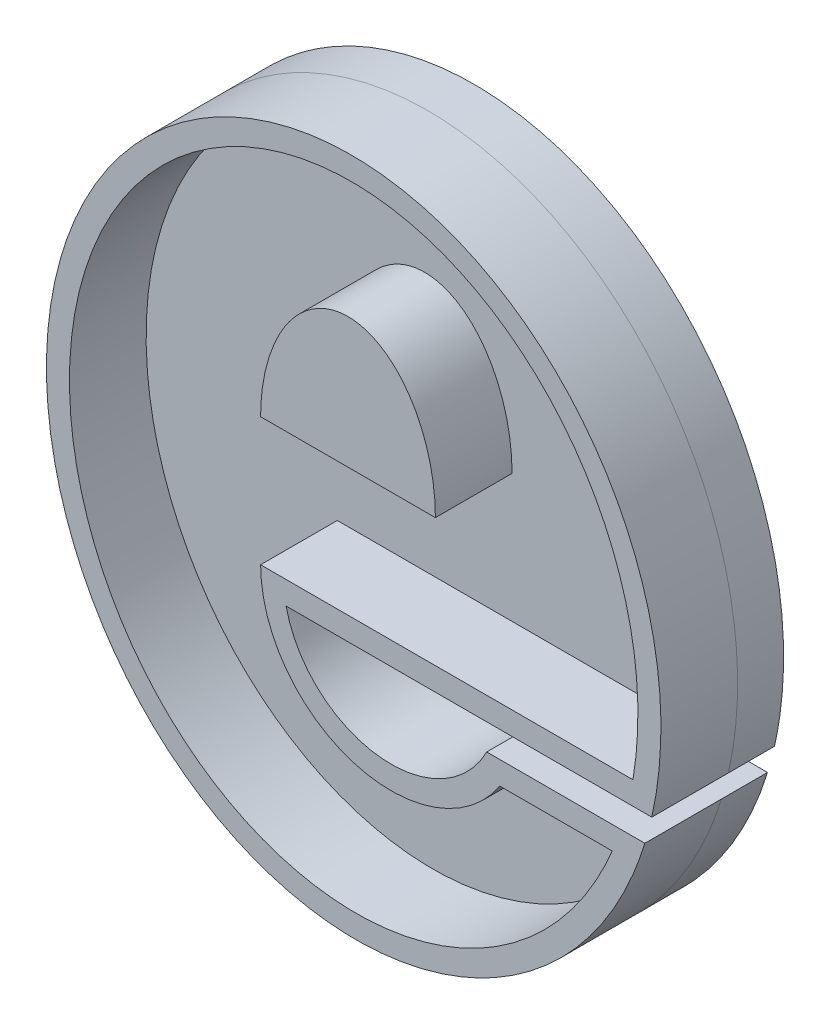
ISO-10303-21;
HEADER;
FILE_DESCRIPTION(('STEP AP214'),'2;1');
FILE_NAME('part.step','',(''),(''),'','','');
FILE_SCHEMA(('AUTOMOTIVE_DESIGN { 1 0 10303 214 1 1 1 1 }'));
ENDSEC;
DATA;
#1=APPLICATION_CONTEXT('core data for automotive mechanical design processes');
#2=APPLICATION_PROTOCOL_DEFINITION('international standard','automotive_design',2000,#1);
#3=PRODUCT_CONTEXT('',#1,'mechanical');
#4=PRODUCT('Part','Part','',(#3));
#5=PRODUCT_RELATED_PRODUCT_CATEGORY('part','',(#4));
#6=PRODUCT_DEFINITION_FORMATION('','',#4);
#7=PRODUCT_DEFINITION_CONTEXT('part definition',#1,'design');
#8=PRODUCT_DEFINITION('design','',#6,#7);
#9=PRODUCT_DEFINITION_SHAPE('','',#8);
#10=(LENGTH_UNIT() NAMED_UNIT(*) SI_UNIT(.MILLI.,.METRE.));
#11=(NAMED_UNIT(*) PLANE_ANGLE_UNIT() SI_UNIT($,.RADIAN.));
#12=(NAMED_UNIT(*) SI_UNIT($,.STERADIAN.) SOLID_ANGLE_UNIT());
#13=UNCERTAINTY_MEASURE_WITH_UNIT(LENGTH_MEASURE(1.E-05),#10,'distance_accuracy_value','');
#14=(GEOMETRIC_REPRESENTATION_CONTEXT(3) GLOBAL_UNCERTAINTY_ASSIGNED_CONTEXT((#13)) GLOBAL_UNIT_ASSIGNED_CONTEXT((#10,
#11,#12)) REPRESENTATION_CONTEXT('',''));
#15=CARTESIAN_POINT('',(0.,0.,0.));
#16=DIRECTION('',(0.,0.,1.));
#17=DIRECTION('',(1.,0.,0.));
#18=AXIS2_PLACEMENT_3D('',#15,#16,#17);
#19=CARTESIAN_POINT('',(2.43894998010459,-4.01549663287577,5.));
#20=DIRECTION('',(0.,0.,1.));
#21=DIRECTION('',(1.,0.,0.));
#22=AXIS2_PLACEMENT_3D('',#19,#20,#21);
#23=PLANE('',#22);
#24=CARTESIAN_POINT('',(2.43894998010459,-4.01549663287577,5.));
#25=DIRECTION('',(0.,0.,-1.));
#26=DIRECTION('',(1.,0.,0.));
#27=AXIS2_PLACEMENT_3D('',#24,#25,#26);
#28=CIRCLE('',#27,7.01);
#29=CARTESIAN_POINT('',(8.67594444859663,-7.21549663287573,5.));
#30=VERTEX_POINT('',#29);
#31=CARTESIAN_POINT('',(-4.40868464799875,-5.51549663287577,5.));
#32=VERTEX_POINT('',#31);
#33=EDGE_CURVE('E206',#30,#32,#28,.T.);
#34=ORIENTED_EDGE('',*,*,#33,.T.);
#35=DIRECTION('',(1.,7.4469390179085E-12,0.));
#36=VECTOR('',#35,1.);
#37=CARTESIAN_POINT('',(-4.40868464799875,-5.51549663287577,5.));
#38=LINE('',#37,#36);
#39=CARTESIAN_POINT('',(19.4413378459101,-5.51549663269816,5.));
#40=VERTEX_POINT('',#39);
#41=EDGE_CURVE('E209',#32,#40,#38,.T.);
#42=ORIENTED_EDGE('',*,*,#41,.T.);
#43=CARTESIAN_POINT('',(19.4413378459101,-5.51549663269816,5.));
#44=CARTESIAN_POINT('',(20.0644750808031,-2.76938934887526,5.));
#45=CARTESIAN_POINT('',(20.3371728987295,2.99499397625619,5.));
#46=CARTESIAN_POINT('',(17.7717027992243,11.2083095359968,5.));
#47=CARTESIAN_POINT('',(12.5782163197493,17.8056525984116,5.));
#48=CARTESIAN_POINT('',(5.47426072221383,21.7911037813687,5.));
#49=CARTESIAN_POINT('',(-2.49105719793422,22.5104083720527,5.));
#50=CARTESIAN_POINT('',(-10.0690867920155,19.832544712174,5.));
#51=CARTESIAN_POINT('',(-16.0955657956478,14.2105751261257,5.));
#52=CARTESIAN_POINT('',(-19.7130802001289,6.52607468019531,5.));
#53=CARTESIAN_POINT('',(-20.43576809698,-2.09172730620284,5.));
#54=CARTESIAN_POINT('',(-18.1711388458301,-10.4079610275275,5.));
#55=CARTESIAN_POINT('',(-13.2243374242688,-17.2246063489635,5.));
#56=CARTESIAN_POINT('',(-6.27583011584605,-21.5204603011031,5.));
#57=CARTESIAN_POINT('',(1.65648015779686,-22.5965329394962,5.));
#58=CARTESIAN_POINT('',(9.33334089175882,-20.2623857931394,5.));
#59=CARTESIAN_POINT('',(14.5283907911395,-15.7997054667533,5.));
#60=CARTESIAN_POINT('',(17.5172304412448,-11.156612751525,5.));
#61=CARTESIAN_POINT('',(18.5805261899058,-8.54737142086325,5.));
#62=CARTESIAN_POINT('',(18.9887513803492,-7.21549663287369,5.));
#63=B_SPLINE_CURVE_WITH_KNOTS('',3,(#43,#44,#45,#46,#47,#48,#49,#50,#51,#52,#53,#54,#55,#56,#57,
#58,#59,#60,#61,#62),.UNSPECIFIED.,.F.,.F.,(4,1,1,1,1,1,1,1,1,1,1,1,1,1,1,1,1,4),
(-1.86025386424803,-1.47260858886801,-1.08496331348799,-0.697318038107974,-0.309672762727954,
0.0779725126520655,0.465617788032085,0.853263063412105,1.24090833879212,1.62855361417214,
2.01619888955216,2.40384416493218,2.7914894403122,3.17913471569222,3.56677999107224,
3.95442526645226,4.14824790414227,4.34207054183228),.UNSPECIFIED.);
#64=CARTESIAN_POINT('',(18.9887513803492,-7.21549663287369,5.));
#65=VERTEX_POINT('',#64);
#66=EDGE_CURVE('E211',#40,#65,#63,.T.);
#67=ORIENTED_EDGE('',*,*,#66,.T.);
#68=DIRECTION('',(-1.,-1.97311037701642E-13,0.));
#69=VECTOR('',#68,1.);
#70=CARTESIAN_POINT('',(8.67594444859663,-7.21549663287573,5.));
#71=LINE('',#70,#69);
#72=EDGE_CURVE('E216',#65,#30,#71,.T.);
#73=ORIENTED_EDGE('',*,*,#72,.T.);
#74=EDGE_LOOP('',(#34,#42,#67,#73));
#75=FACE_BOUND('',#74,.T.);
#76=DIRECTION('',(1.,0.,0.));
#77=VECTOR('',#76,1.);
#78=CARTESIAN_POINT('',(-6.07105001989541,-4.01549663287577,5.));
#79=LINE('',#78,#77);
#80=CARTESIAN_POINT('',(-6.07105001989541,-4.01549663287577,5.));
#81=VERTEX_POINT('',#80);
#82=CARTESIAN_POINT('',(18.2111265578361,-4.01549663287578,5.));
#83=VERTEX_POINT('',#82);
#84=EDGE_CURVE('E180',#81,#83,#79,.T.);
#85=ORIENTED_EDGE('',*,*,#84,.F.);
#86=CARTESIAN_POINT('',(2.43894998010459,-4.01549663287577,5.));
#87=DIRECTION('',(0.,0.,-1.));
#88=DIRECTION('',(1.,0.,0.));
#89=AXIS2_PLACEMENT_3D('',#86,#87,#88);
#90=CIRCLE('',#89,8.51);
#91=CARTESIAN_POINT('',(9.53332098816447,-8.71549663287573,5.));
#92=VERTEX_POINT('',#91);
#93=EDGE_CURVE('E197',#92,#81,#90,.T.);
#94=ORIENTED_EDGE('',*,*,#93,.F.);
#95=DIRECTION('',(-1.,0.,0.));
#96=VECTOR('',#95,1.);
#97=CARTESIAN_POINT('',(9.53332098816447,-8.71549663287573,5.));
#98=LINE('',#97,#96);
#99=CARTESIAN_POINT('',(16.8585818302671,-8.71549663287573,5.));
#100=VERTEX_POINT('',#99);
#101=EDGE_CURVE('E179',#100,#92,#98,.T.);
#102=ORIENTED_EDGE('',*,*,#101,.F.);
#103=CARTESIAN_POINT('',(0.,0.,5.));
#104=DIRECTION('',(0.,0.,1.));
#105=DIRECTION('',(-0.0387903560305712,0.99924737091424,0.));
#106=AXIS2_PLACEMENT_3D('',#103,#104,#105);
#107=ELLIPSE('',#106,20.5900000000001,18.535);
#108=EDGE_CURVE('E175',#83,#100,#107,.T.);
#109=ORIENTED_EDGE('',*,*,#108,.F.);
#110=EDGE_LOOP('',(#85,#94,#102,#109));
#111=FACE_BOUND('',#110,.T.);
#112=ADVANCED_FACE('F41',(#75,#111),#23,.T.);
#113=CARTESIAN_POINT('',(2.43894998010459,-4.01549663287577,5.));
#114=DIRECTION('',(0.,0.,-1.));
#115=DIRECTION('',(-1.,0.,0.));
#116=AXIS2_PLACEMENT_3D('',#113,#114,#115);
#117=CYLINDRICAL_SURFACE('',#116,7.01);
#118=DIRECTION('',(0.,0.,-1.));
#119=VECTOR('',#118,1.);
#120=CARTESIAN_POINT('',(8.67594444859663,-7.21549663287573,5.));
#121=LINE('',#120,#119);
#122=CARTESIAN_POINT('',(8.67594444859664,-7.21549663287571,-3.));
#123=VERTEX_POINT('',#122);
#124=EDGE_CURVE('E275',#30,#123,#121,.T.);
#125=ORIENTED_EDGE('',*,*,#124,.T.);
#126=CARTESIAN_POINT('',(2.43894998010459,-4.01549663287578,-3.));
#127=DIRECTION('',(0.,0.,1.));
#128=DIRECTION('',(-1.,0.,0.));
#129=AXIS2_PLACEMENT_3D('',#126,#127,#128);
#130=CIRCLE('',#129,7.01);
#131=CARTESIAN_POINT('',(-4.40868464799875,-5.51549663287578,-3.));
#132=VERTEX_POINT('',#131);
#133=EDGE_CURVE('E264',#132,#123,#130,.T.);
#134=ORIENTED_EDGE('',*,*,#133,.F.);
#135=DIRECTION('',(0.,0.,-1.));
#136=VECTOR('',#135,1.);
#137=CARTESIAN_POINT('',(-4.40868464799875,-5.51549663287577,5.));
#138=LINE('',#137,#136);
#139=EDGE_CURVE('E11',#32,#132,#138,.T.);
#140=ORIENTED_EDGE('',*,*,#139,.F.);
#141=ORIENTED_EDGE('',*,*,#33,.F.);
#142=EDGE_LOOP('',(#125,#134,#140,#141));
#143=FACE_BOUND('',#142,.T.);
#144=ADVANCED_FACE('F43',(#143),#117,.F.);
#145=CARTESIAN_POINT('',(-4.40868464799875,-5.51549663287577,5.));
#146=DIRECTION('',(-7.4469390179085E-12,1.,0.));
#147=DIRECTION('',(-1.,-7.4469390179085E-12,0.));
#148=AXIS2_PLACEMENT_3D('',#145,#146,#147);
#149=PLANE('',#148);
#150=ORIENTED_EDGE('',*,*,#139,.T.);
#151=DIRECTION('',(-1.,0.,0.));
#152=VECTOR('',#151,1.);
#153=CARTESIAN_POINT('',(19.4413378458698,-5.51549663287578,-3.));
#154=LINE('',#153,#152);
#155=CARTESIAN_POINT('',(19.4413378458698,-5.51549663287578,-3.));
#156=VERTEX_POINT('',#155);
#157=EDGE_CURVE('E151',#156,#132,#154,.T.);
#158=ORIENTED_EDGE('',*,*,#157,.F.);
#159=DIRECTION('',(0.,0.,1.));
#160=VECTOR('',#159,1.);
#161=CARTESIAN_POINT('',(19.4413378458698,-5.51549663287578,-3.));
#162=LINE('',#161,#160);
#163=CARTESIAN_POINT('',(19.4413378459101,-5.51549663269816,0.));
#164=VERTEX_POINT('',#163);
#165=EDGE_CURVE('E188',#156,#164,#162,.T.);
#166=ORIENTED_EDGE('',*,*,#165,.T.);
#167=DIRECTION('',(0.,0.,-1.));
#168=VECTOR('',#167,1.);
#169=CARTESIAN_POINT('',(19.4413378459101,-5.51549663269816,5.));
#170=LINE('',#169,#168);
#171=EDGE_CURVE('E49',#40,#164,#170,.T.);
#172=ORIENTED_EDGE('',*,*,#171,.F.);
#173=ORIENTED_EDGE('',*,*,#41,.F.);
#174=EDGE_LOOP('',(#150,#158,#166,#172,#173));
#175=FACE_BOUND('',#174,.T.);
#176=ADVANCED_FACE('F226',(#175),#149,.F.);
#177=DIRECTION('',(0.,0.,-1.));
#178=VECTOR('',#177,1.);
#179=SURFACE_OF_LINEAR_EXTRUSION('',#63,#178);
#180=CARTESIAN_POINT('',(19.4413378459101,-5.51549663269816,0.));
#181=CARTESIAN_POINT('',(20.0644750808031,-2.76938934887526,0.));
#182=CARTESIAN_POINT('',(20.3371728987295,2.99499397625619,0.));
#183=CARTESIAN_POINT('',(17.7717027992243,11.2083095359968,0.));
#184=CARTESIAN_POINT('',(12.5782163197493,17.8056525984116,0.));
#185=CARTESIAN_POINT('',(5.47426072221383,21.7911037813687,0.));
#186=CARTESIAN_POINT('',(-2.49105719793422,22.5104083720527,0.));
#187=CARTESIAN_POINT('',(-10.0690867920155,19.832544712174,0.));
#188=CARTESIAN_POINT('',(-16.0955657956478,14.2105751261257,0.));
#189=CARTESIAN_POINT('',(-19.7130802001289,6.52607468019531,0.));
#190=CARTESIAN_POINT('',(-20.43576809698,-2.09172730620284,0.));
#191=CARTESIAN_POINT('',(-18.1711388458301,-10.4079610275275,0.));
#192=CARTESIAN_POINT('',(-13.2243374242688,-17.2246063489635,0.));
#193=CARTESIAN_POINT('',(-6.27583011584605,-21.5204603011031,0.));
#194=CARTESIAN_POINT('',(1.65648015779686,-22.5965329394962,0.));
#195=CARTESIAN_POINT('',(9.33334089175882,-20.2623857931394,0.));
#196=CARTESIAN_POINT('',(14.5283907911395,-15.7997054667533,0.));
#197=CARTESIAN_POINT('',(17.5172304412448,-11.156612751525,0.));
#198=CARTESIAN_POINT('',(18.5805261899058,-8.54737142086325,0.));
#199=CARTESIAN_POINT('',(18.9887513803492,-7.21549663287369,0.));
#200=B_SPLINE_CURVE_WITH_KNOTS('',3,(#180,#181,#182,#183,#184,#185,#186,#187,#188,#189,#190,
#191,#192,#193,#194,#195,#196,#197,#198,#199),.UNSPECIFIED.,.F.,.F.,(4,1,1,1,1,1,1,1,1,1,1,1,1,
1,1,1,1,4),(-1.86025386424803,-1.47260858886801,-1.08496331348799,-0.697318038107974,
-0.309672762727954,0.0779725126520655,0.465617788032085,0.853263063412105,1.24090833879212,
1.62855361417214,2.01619888955216,2.40384416493218,2.7914894403122,3.17913471569222,
3.56677999107224,3.95442526645226,4.14824790414227,4.34207054183228),.UNSPECIFIED.);
#201=CARTESIAN_POINT('',(18.9887513803486,-7.21549663287572,0.));
#202=VERTEX_POINT('',#201);
#203=EDGE_CURVE('E205',#164,#202,#200,.T.);
#204=ORIENTED_EDGE('',*,*,#203,.T.);
#205=DIRECTION('',(0.,0.,-1.));
#206=VECTOR('',#205,1.);
#207=CARTESIAN_POINT('',(18.9887513803492,-7.21549663287369,5.));
#208=LINE('',#207,#206);
#209=EDGE_CURVE('E277',#65,#202,#208,.T.);
#210=ORIENTED_EDGE('',*,*,#209,.F.);
#211=ORIENTED_EDGE('',*,*,#66,.F.);
#212=ORIENTED_EDGE('',*,*,#171,.T.);
#213=EDGE_LOOP('',(#204,#210,#211,#212));
#214=FACE_BOUND('',#213,.T.);
#215=ADVANCED_FACE('F222',(#214),#179,.F.);
#216=CARTESIAN_POINT('',(8.67594444859663,-7.21549663287573,5.));
#217=DIRECTION('',(1.97311037701642E-13,-1.,0.));
#218=DIRECTION('',(1.,1.97311037701642E-13,0.));
#219=AXIS2_PLACEMENT_3D('',#216,#217,#218);
#220=PLANE('',#219);
#221=ORIENTED_EDGE('',*,*,#209,.T.);
#222=DIRECTION('',(0.,0.,1.));
#223=VECTOR('',#222,1.);
#224=CARTESIAN_POINT('',(18.9887513803486,-7.21549663287572,-3.));
#225=LINE('',#224,#223);
#226=CARTESIAN_POINT('',(18.9887513803486,-7.21549663287572,-3.));
#227=VERTEX_POINT('',#226);
#228=EDGE_CURVE('E261',#227,#202,#225,.T.);
#229=ORIENTED_EDGE('',*,*,#228,.F.);
#230=DIRECTION('',(1.,0.,0.));
#231=VECTOR('',#230,1.);
#232=CARTESIAN_POINT('',(18.9887513803486,-7.21549663287572,-3.));
#233=LINE('',#232,#231);
#234=EDGE_CURVE('E263',#123,#227,#233,.T.);
#235=ORIENTED_EDGE('',*,*,#234,.F.);
#236=ORIENTED_EDGE('',*,*,#124,.F.);
#237=ORIENTED_EDGE('',*,*,#72,.F.);
#238=EDGE_LOOP('',(#221,#229,#235,#236,#237));
#239=FACE_BOUND('',#238,.T.);
#240=ADVANCED_FACE('F225',(#239),#220,.F.);
#241=CARTESIAN_POINT('',(2.43894998010459,-4.01549663287577,5.));
#242=DIRECTION('',(0.,0.,-1.));
#243=DIRECTION('',(-1.,0.,0.));
#244=AXIS2_PLACEMENT_3D('',#241,#242,#243);
#245=CYLINDRICAL_SURFACE('',#244,8.51);
#246=CARTESIAN_POINT('',(2.43894998010459,-4.01549663287577,0.));
#247=DIRECTION('',(0.,0.,-1.));
#248=DIRECTION('',(1.,0.,0.));
#249=AXIS2_PLACEMENT_3D('',#246,#247,#248);
#250=CIRCLE('',#249,8.51);
#251=CARTESIAN_POINT('',(9.53332098816447,-8.71549663287573,0.));
#252=VERTEX_POINT('',#251);
#253=CARTESIAN_POINT('',(-6.07105001989541,-4.01549663287577,0.));
#254=VERTEX_POINT('',#253);
#255=EDGE_CURVE('E184',#252,#254,#250,.T.);
#256=ORIENTED_EDGE('',*,*,#255,.F.);
#257=DIRECTION('',(0.,0.,-1.));
#258=VECTOR('',#257,1.);
#259=CARTESIAN_POINT('',(9.53332098816447,-8.71549663287573,5.));
#260=LINE('',#259,#258);
#261=EDGE_CURVE('E183',#92,#252,#260,.T.);
#262=ORIENTED_EDGE('',*,*,#261,.F.);
#263=ORIENTED_EDGE('',*,*,#93,.T.);
#264=DIRECTION('',(0.,0.,-1.));
#265=VECTOR('',#264,1.);
#266=CARTESIAN_POINT('',(-6.07105001989541,-4.01549663287577,5.));
#267=LINE('',#266,#265);
#268=EDGE_CURVE('E202',#81,#254,#267,.T.);
#269=ORIENTED_EDGE('',*,*,#268,.T.);
#270=EDGE_LOOP('',(#256,#262,#263,#269));
#271=FACE_BOUND('',#270,.T.);
#272=ADVANCED_FACE('F240',(#271),#245,.T.);
#273=CARTESIAN_POINT('',(-6.07105001989541,-4.01549663287577,5.));
#274=DIRECTION('',(0.,1.,0.));
#275=DIRECTION('',(-1.,0.,0.));
#276=AXIS2_PLACEMENT_3D('',#273,#274,#275);
#277=PLANE('',#276);
#278=DIRECTION('',(1.,0.,0.));
#279=VECTOR('',#278,1.);
#280=CARTESIAN_POINT('',(-6.07105001989541,-4.01549663287577,0.));
#281=LINE('',#280,#279);
#282=CARTESIAN_POINT('',(18.2111265578361,-4.01549663287578,0.));
#283=VERTEX_POINT('',#282);
#284=EDGE_CURVE('E187',#254,#283,#281,.T.);
#285=ORIENTED_EDGE('',*,*,#284,.F.);
#286=ORIENTED_EDGE('',*,*,#268,.F.);
#287=ORIENTED_EDGE('',*,*,#84,.T.);
#288=DIRECTION('',(0.,0.,-1.));
#289=VECTOR('',#288,1.);
#290=CARTESIAN_POINT('',(18.2111265578361,-4.01549663287578,5.));
#291=LINE('',#290,#289);
#292=EDGE_CURVE('E200',#83,#283,#291,.T.);
#293=ORIENTED_EDGE('',*,*,#292,.T.);
#294=EDGE_LOOP('',(#285,#286,#287,#293));
#295=FACE_BOUND('',#294,.T.);
#296=ADVANCED_FACE('F172',(#295),#277,.T.);
#297=DIRECTION('',(0.,0.,-1.));
#298=VECTOR('',#297,1.);
#299=SURFACE_OF_LINEAR_EXTRUSION('',#107,#298);
#300=CARTESIAN_POINT('',(0.,0.,0.));
#301=DIRECTION('',(0.,0.,1.));
#302=DIRECTION('',(-0.0387903560305712,0.99924737091424,0.));
#303=AXIS2_PLACEMENT_3D('',#300,#301,#302);
#304=ELLIPSE('',#303,20.5900000000001,18.535);
#305=CARTESIAN_POINT('',(16.8585818302671,-8.71549663287571,0.));
#306=VERTEX_POINT('',#305);
#307=EDGE_CURVE('E191',#283,#306,#304,.T.);
#308=ORIENTED_EDGE('',*,*,#307,.F.);
#309=ORIENTED_EDGE('',*,*,#292,.F.);
#310=ORIENTED_EDGE('',*,*,#108,.T.);
#311=DIRECTION('',(0.,0.,-1.));
#312=VECTOR('',#311,1.);
#313=CARTESIAN_POINT('',(16.8585818302671,-8.71549663287571,5.));
#314=LINE('',#313,#312);
#315=EDGE_CURVE('E63',#100,#306,#314,.T.);
#316=ORIENTED_EDGE('',*,*,#315,.T.);
#317=EDGE_LOOP('',(#308,#309,#310,#316));
#318=FACE_BOUND('',#317,.T.);
#319=ADVANCED_FACE('F168',(#318),#299,.T.);
#320=CARTESIAN_POINT('',(9.53332098816447,-8.71549663287573,5.));
#321=DIRECTION('',(0.,-1.,0.));
#322=DIRECTION('',(0.,0.,-1.));
#323=AXIS2_PLACEMENT_3D('',#320,#321,#322);
#324=PLANE('',#323);
#325=DIRECTION('',(-1.,0.,0.));
#326=VECTOR('',#325,1.);
#327=CARTESIAN_POINT('',(9.53332098816447,-8.71549663287573,0.));
#328=LINE('',#327,#326);
#329=EDGE_CURVE('E194',#306,#252,#328,.T.);
#330=ORIENTED_EDGE('',*,*,#329,.F.);
#331=ORIENTED_EDGE('',*,*,#315,.F.);
#332=ORIENTED_EDGE('',*,*,#101,.T.);
#333=ORIENTED_EDGE('',*,*,#261,.T.);
#334=EDGE_LOOP('',(#330,#331,#332,#333));
#335=FACE_BOUND('',#334,.T.);
#336=ADVANCED_FACE('F165',(#335),#324,.T.);
#337=CARTESIAN_POINT('',(-19.2306091155002,6.37052442353957,0.));
#338=DIRECTION('',(0.,0.,1.));
#339=DIRECTION('',(1.,0.,0.));
#340=AXIS2_PLACEMENT_3D('',#337,#338,#339);
#341=PLANE('',#340);
#342=CARTESIAN_POINT('',(-0.371050019895405,4.34450336712423,0.));
#343=DIRECTION('',(0.,0.,1.));
#344=DIRECTION('',(0.,1.,0.));
#345=AXIS2_PLACEMENT_3D('',#342,#343,#344);
#346=ELLIPSE('',#345,8.51,5.7);
#347=CARTESIAN_POINT('',(5.3289499801046,4.34450336712423,0.));
#348=VERTEX_POINT('',#347);
#349=CARTESIAN_POINT('',(-6.07105001989541,4.34450336712423,0.));
#350=VERTEX_POINT('',#349);
#351=EDGE_CURVE('E129',#348,#350,#346,.T.);
#352=ORIENTED_EDGE('',*,*,#351,.F.);
#353=DIRECTION('',(1.,0.,0.));
#354=VECTOR('',#353,1.);
#355=CARTESIAN_POINT('',(-19.2306091155002,4.34450336712422,0.));
#356=LINE('',#355,#354);
#357=EDGE_CURVE('E55',#350,#348,#356,.T.);
#358=ORIENTED_EDGE('',*,*,#357,.F.);
#359=EDGE_LOOP('',(#352,#358));
#360=FACE_BOUND('',#359,.T.);
#361=ORIENTED_EDGE('',*,*,#329,.T.);
#362=ORIENTED_EDGE('',*,*,#255,.T.);
#363=ORIENTED_EDGE('',*,*,#284,.T.);
#364=ORIENTED_EDGE('',*,*,#307,.T.);
#365=EDGE_LOOP('',(#361,#362,#363,#364));
#366=FACE_BOUND('',#365,.T.);
#367=ADVANCED_FACE('F162',(#360,#366),#341,.T.);
#368=CARTESIAN_POINT('',(18.9887513803486,-7.21549663287572,-3.));
#369=CARTESIAN_POINT('',(18.5805261899045,-8.547371420867,-3.));
#370=CARTESIAN_POINT('',(17.5172304412415,-11.156612751532,-3.));
#371=CARTESIAN_POINT('',(14.5283907911301,-15.799705466765,-3.));
#372=CARTESIAN_POINT('',(9.33334089173868,-20.2623857931523,-3.));
#373=CARTESIAN_POINT('',(1.65648015776293,-22.5965329395005,-3.));
#374=CARTESIAN_POINT('',(-6.27583011588908,-21.5204603010891,-3.));
#375=CARTESIAN_POINT('',(-13.2243374243118,-17.2246063489252,-3.));
#376=CARTESIAN_POINT('',(-18.1711388458617,-10.4079610274642,-3.));
#377=CARTESIAN_POINT('',(-20.4357680969889,-2.09172730611997,-3.));
#378=CARTESIAN_POINT('',(-19.713080200106,6.52607468028678,-3.));
#379=CARTESIAN_POINT('',(-16.0955657955885,14.2105751262102,-3.));
#380=CARTESIAN_POINT('',(-10.0690867919215,19.8325447122332,-3.));
#381=CARTESIAN_POINT('',(-2.49105719781549,22.5104083720693,-3.));
#382=CARTESIAN_POINT('',(5.47426072233971,21.7911037813309,-3.));
#383=CARTESIAN_POINT('',(12.5782163198607,17.8056525983174,-3.));
#384=CARTESIAN_POINT('',(17.7717027993005,11.2083095358542,-3.));
#385=CARTESIAN_POINT('',(20.3371728987531,2.99499397608148,-3.));
#386=CARTESIAN_POINT('',(20.0644750807845,-2.76938934905436,-3.));
#387=CARTESIAN_POINT('',(19.4413378458698,-5.51549663287578,-3.));
#388=B_SPLINE_CURVE_WITH_KNOTS('',3,(#368,#369,#370,#371,#372,#373,#374,#375,#376,#377,#378,
#379,#380,#381,#382,#383,#384,#385,#386,#387),.UNSPECIFIED.,.F.,.F.,(4,1,1,1,1,1,1,1,1,1,1,1,1,
1,1,1,1,4),(1.9411147653474,2.13493740303767,2.32876004072794,2.71640531610847,3.10405059148901,
3.49169586686955,3.87934114225008,4.26698641763062,4.65463169301115,5.04227696839169,
5.42992224377222,5.81756751915276,6.20521279453329,6.59285806991383,6.98050334529436,
7.3681486206749,7.75579389605544,8.14343917143597),.UNSPECIFIED.);
#389=DIRECTION('',(0.,0.,1.));
#390=VECTOR('',#389,1.);
#391=SURFACE_OF_LINEAR_EXTRUSION('',#388,#390);
#392=ORIENTED_EDGE('',*,*,#203,.F.);
#393=ORIENTED_EDGE('',*,*,#165,.F.);
#394=EDGE_CURVE('E145',#227,#156,#388,.T.);
#395=ORIENTED_EDGE('',*,*,#394,.F.);
#396=ORIENTED_EDGE('',*,*,#228,.T.);
#397=EDGE_LOOP('',(#392,#393,#395,#396));
#398=FACE_BOUND('',#397,.T.);
#399=ADVANCED_FACE('F157',(#398),#391,.F.);
#400=CARTESIAN_POINT('',(-19.2306091155002,6.37052442353957,-3.));
#401=DIRECTION('',(0.,0.,1.));
#402=DIRECTION('',(1.,0.,0.));
#403=AXIS2_PLACEMENT_3D('',#400,#401,#402);
#404=PLANE('',#403);
#405=ORIENTED_EDGE('',*,*,#394,.T.);
#406=ORIENTED_EDGE('',*,*,#157,.T.);
#407=ORIENTED_EDGE('',*,*,#133,.T.);
#408=ORIENTED_EDGE('',*,*,#234,.T.);
#409=EDGE_LOOP('',(#405,#406,#407,#408));
#410=FACE_BOUND('',#409,.T.);
#411=ADVANCED_FACE('F161',(#410),#404,.F.);
#412=CARTESIAN_POINT('',(-0.371050019895405,4.34450336712423,-3.));
#413=DIRECTION('',(0.,0.,1.));
#414=DIRECTION('',(0.,1.,0.));
#415=AXIS2_PLACEMENT_3D('',#412,#413,#414);
#416=ELLIPSE('',#415,8.51,5.7);
#417=DIRECTION('',(0.,0.,1.));
#418=VECTOR('',#417,1.);
#419=SURFACE_OF_LINEAR_EXTRUSION('',#416,#418);
#420=DIRECTION('',(0.,0.,1.));
#421=VECTOR('',#420,1.);
#422=CARTESIAN_POINT('',(5.3289499801046,4.34450336712423,-3.));
#423=LINE('',#422,#421);
#424=CARTESIAN_POINT('',(5.3289499801046,4.34450336712423,5.));
#425=VERTEX_POINT('',#424);
#426=EDGE_CURVE('E132',#348,#425,#423,.T.);
#427=ORIENTED_EDGE('',*,*,#426,.F.);
#428=ORIENTED_EDGE('',*,*,#351,.T.);
#429=DIRECTION('',(0.,0.,1.));
#430=VECTOR('',#429,1.);
#431=CARTESIAN_POINT('',(-6.07105001989541,4.34450336712423,-3.));
#432=LINE('',#431,#430);
#433=CARTESIAN_POINT('',(-6.07105001989541,4.34450336712423,5.));
#434=VERTEX_POINT('',#433);
#435=EDGE_CURVE('E123',#350,#434,#432,.T.);
#436=ORIENTED_EDGE('',*,*,#435,.T.);
#437=CARTESIAN_POINT('',(-0.371050019895405,4.34450336712423,5.));
#438=DIRECTION('',(0.,0.,1.));
#439=DIRECTION('',(0.,1.,0.));
#440=AXIS2_PLACEMENT_3D('',#437,#438,#439);
#441=ELLIPSE('',#440,8.51,5.7);
#442=EDGE_CURVE('E127',#425,#434,#441,.T.);
#443=ORIENTED_EDGE('',*,*,#442,.F.);
#444=EDGE_LOOP('',(#427,#428,#436,#443));
#445=FACE_BOUND('',#444,.T.);
#446=ADVANCED_FACE('F126',(#445),#419,.T.);
#447=CARTESIAN_POINT('',(-6.07105001989541,4.34450336712423,-3.));
#448=DIRECTION('',(0.,-1.,0.));
#449=DIRECTION('',(1.,0.,0.));
#450=AXIS2_PLACEMENT_3D('',#447,#448,#449);
#451=PLANE('',#450);
#452=ORIENTED_EDGE('',*,*,#435,.F.);
#453=ORIENTED_EDGE('',*,*,#357,.T.);
#454=ORIENTED_EDGE('',*,*,#426,.T.);
#455=DIRECTION('',(1.,0.,0.));
#456=VECTOR('',#455,1.);
#457=CARTESIAN_POINT('',(-6.07105001989541,4.34450336712423,5.));
#458=LINE('',#457,#456);
#459=EDGE_CURVE('E133',#434,#425,#458,.T.);
#460=ORIENTED_EDGE('',*,*,#459,.F.);
#461=EDGE_LOOP('',(#452,#453,#454,#460));
#462=FACE_BOUND('',#461,.T.);
#463=ADVANCED_FACE('F138',(#462),#451,.T.);
#464=CARTESIAN_POINT('',(-0.371050019895405,4.34450336712423,5.));
#465=DIRECTION('',(0.,0.,1.));
#466=DIRECTION('',(1.,0.,0.));
#467=AXIS2_PLACEMENT_3D('',#464,#465,#466);
#468=PLANE('',#467);
#469=ORIENTED_EDGE('',*,*,#442,.T.);
#470=ORIENTED_EDGE('',*,*,#459,.T.);
#471=EDGE_LOOP('',(#469,#470));
#472=FACE_BOUND('',#471,.T.);
#473=ADVANCED_FACE('F136',(#472),#468,.T.);
#474=CLOSED_SHELL('',(#112,#144,#176,#215,#240,#272,#296,#319,#336,#367,#399,#411,#446,#463,#473));
#475=MANIFOLD_SOLID_BREP('B2',#474);
#476=ADVANCED_BREP_SHAPE_REPRESENTATION('',(#18,#475),#14);
#477=SHAPE_DEFINITION_REPRESENTATION(#9,#476);
ENDSEC;
END-ISO-10303-21;
